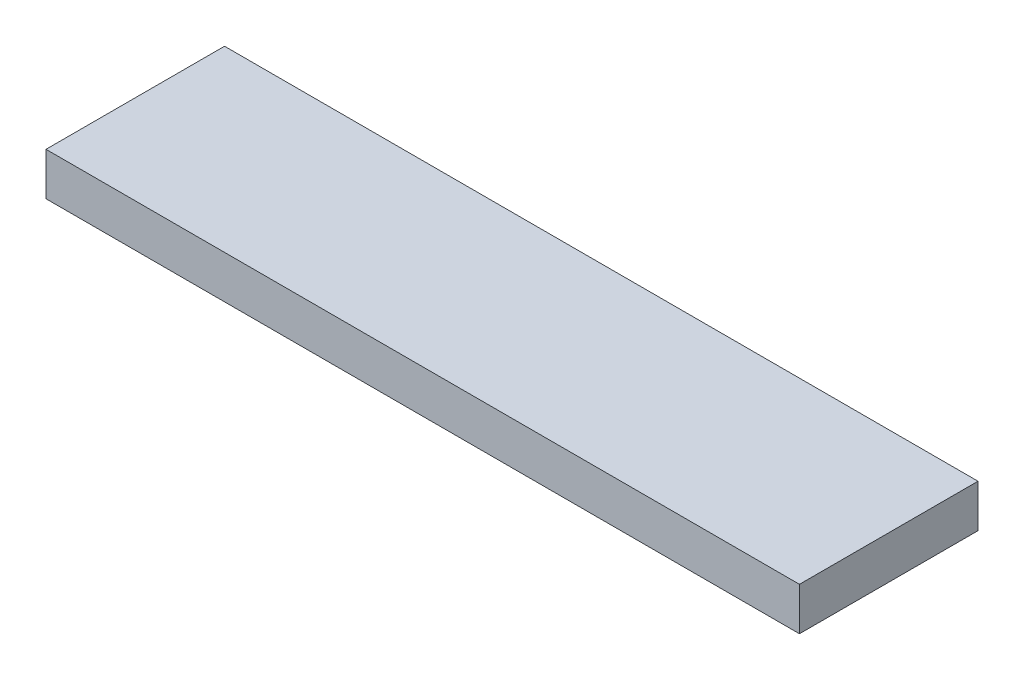
ISO-10303-21;
HEADER;
FILE_DESCRIPTION(('STEP AP214'),'2;1');
FILE_NAME('part.step','',(''),(''),'','','');
FILE_SCHEMA(('AUTOMOTIVE_DESIGN { 1 0 10303 214 1 1 1 1 }'));
ENDSEC;
DATA;
#1=APPLICATION_CONTEXT('core data for automotive mechanical design processes');
#2=APPLICATION_PROTOCOL_DEFINITION('international standard','automotive_design',2000,#1);
#3=PRODUCT_CONTEXT('',#1,'mechanical');
#4=PRODUCT('Part','Part','',(#3));
#5=PRODUCT_RELATED_PRODUCT_CATEGORY('part','',(#4));
#6=PRODUCT_DEFINITION_FORMATION('','',#4);
#7=PRODUCT_DEFINITION_CONTEXT('part definition',#1,'design');
#8=PRODUCT_DEFINITION('design','',#6,#7);
#9=PRODUCT_DEFINITION_SHAPE('','',#8);
#10=(LENGTH_UNIT() NAMED_UNIT(*) SI_UNIT(.MILLI.,.METRE.));
#11=(NAMED_UNIT(*) PLANE_ANGLE_UNIT() SI_UNIT($,.RADIAN.));
#12=(NAMED_UNIT(*) SI_UNIT($,.STERADIAN.) SOLID_ANGLE_UNIT());
#13=UNCERTAINTY_MEASURE_WITH_UNIT(LENGTH_MEASURE(1.E-05),#10,'distance_accuracy_value','');
#14=(GEOMETRIC_REPRESENTATION_CONTEXT(3) GLOBAL_UNCERTAINTY_ASSIGNED_CONTEXT((#13)) GLOBAL_UNIT_ASSIGNED_CONTEXT((#10,
#11,#12)) REPRESENTATION_CONTEXT('',''));
#15=CARTESIAN_POINT('',(0.,0.,0.));
#16=DIRECTION('',(0.,0.,1.));
#17=DIRECTION('',(1.,0.,0.));
#18=AXIS2_PLACEMENT_3D('',#15,#16,#17);
#19=CARTESIAN_POINT('',(105.5,12.,-24.9999999999998));
#20=DIRECTION('',(-1.,0.,0.));
#21=DIRECTION('',(0.,0.,0.999999999999998));
#22=AXIS2_PLACEMENT_3D('',#19,#20,#21);
#23=PLANE('',#22);
#24=DIRECTION('',(0.,0.,-0.999999999999998));
#25=VECTOR('',#24,1.);
#26=CARTESIAN_POINT('',(105.5,0.,-24.9999999999998));
#27=LINE('',#26,#25);
#28=CARTESIAN_POINT('',(105.5,0.,24.9999999999997));
#29=VERTEX_POINT('',#28);
#30=CARTESIAN_POINT('',(105.5,0.,-24.9999999999998));
#31=VERTEX_POINT('',#30);
#32=EDGE_CURVE('E95',#29,#31,#27,.T.);
#33=ORIENTED_EDGE('',*,*,#32,.T.);
#34=DIRECTION('',(0.,-1.,0.));
#35=VECTOR('',#34,1.);
#36=CARTESIAN_POINT('',(105.5,12.,-24.9999999999998));
#37=LINE('',#36,#35);
#38=CARTESIAN_POINT('',(105.5,12.,-24.9999999999998));
#39=VERTEX_POINT('',#38);
#40=EDGE_CURVE('E11',#39,#31,#37,.T.);
#41=ORIENTED_EDGE('',*,*,#40,.F.);
#42=DIRECTION('',(0.,0.,-0.999999999999998));
#43=VECTOR('',#42,1.);
#44=CARTESIAN_POINT('',(105.5,12.,-24.9999999999998));
#45=LINE('',#44,#43);
#46=CARTESIAN_POINT('',(105.5,12.,24.9999999999997));
#47=VERTEX_POINT('',#46);
#48=EDGE_CURVE('E83',#47,#39,#45,.T.);
#49=ORIENTED_EDGE('',*,*,#48,.F.);
#50=DIRECTION('',(0.,-1.,0.));
#51=VECTOR('',#50,1.);
#52=CARTESIAN_POINT('',(105.5,12.,24.9999999999997));
#53=LINE('',#52,#51);
#54=EDGE_CURVE('E91',#47,#29,#53,.T.);
#55=ORIENTED_EDGE('',*,*,#54,.T.);
#56=EDGE_LOOP('',(#33,#41,#49,#55));
#57=FACE_BOUND('',#56,.T.);
#58=ADVANCED_FACE('F32',(#57),#23,.F.);
#59=CARTESIAN_POINT('',(-105.5,12.,-25.));
#60=DIRECTION('',(0.,0.,0.999999999999998));
#61=DIRECTION('',(1.,0.,0.));
#62=AXIS2_PLACEMENT_3D('',#59,#60,#61);
#63=PLANE('',#62);
#64=DIRECTION('',(-1.,0.,0.));
#65=VECTOR('',#64,1.);
#66=CARTESIAN_POINT('',(-105.5,0.,-25.));
#67=LINE('',#66,#65);
#68=CARTESIAN_POINT('',(-105.5,0.,-25.));
#69=VERTEX_POINT('',#68);
#70=EDGE_CURVE('E87',#31,#69,#67,.T.);
#71=ORIENTED_EDGE('',*,*,#70,.T.);
#72=DIRECTION('',(0.,-1.,0.));
#73=VECTOR('',#72,1.);
#74=CARTESIAN_POINT('',(-105.5,12.,-25.));
#75=LINE('',#74,#73);
#76=CARTESIAN_POINT('',(-105.5,12.,-25.));
#77=VERTEX_POINT('',#76);
#78=EDGE_CURVE('E40',#77,#69,#75,.T.);
#79=ORIENTED_EDGE('',*,*,#78,.F.);
#80=DIRECTION('',(-1.,0.,0.));
#81=VECTOR('',#80,1.);
#82=CARTESIAN_POINT('',(-105.5,12.,-25.));
#83=LINE('',#82,#81);
#84=EDGE_CURVE('E78',#39,#77,#83,.T.);
#85=ORIENTED_EDGE('',*,*,#84,.F.);
#86=ORIENTED_EDGE('',*,*,#40,.T.);
#87=EDGE_LOOP('',(#71,#79,#85,#86));
#88=FACE_BOUND('',#87,.T.);
#89=ADVANCED_FACE('F86',(#88),#63,.F.);
#90=CARTESIAN_POINT('',(-105.5,12.,-25.));
#91=DIRECTION('',(1.,0.,0.));
#92=DIRECTION('',(0.,0.,-0.999999999999998));
#93=AXIS2_PLACEMENT_3D('',#90,#91,#92);
#94=PLANE('',#93);
#95=DIRECTION('',(0.,0.,0.999999999999998));
#96=VECTOR('',#95,1.);
#97=CARTESIAN_POINT('',(-105.5,0.,-25.));
#98=LINE('',#97,#96);
#99=CARTESIAN_POINT('',(-105.5,0.,25.));
#100=VERTEX_POINT('',#99);
#101=EDGE_CURVE('E65',#69,#100,#98,.T.);
#102=ORIENTED_EDGE('',*,*,#101,.T.);
#103=DIRECTION('',(0.,-1.,0.));
#104=VECTOR('',#103,1.);
#105=CARTESIAN_POINT('',(-105.5,12.,25.));
#106=LINE('',#105,#104);
#107=CARTESIAN_POINT('',(-105.5,12.,25.));
#108=VERTEX_POINT('',#107);
#109=EDGE_CURVE('E88',#108,#100,#106,.T.);
#110=ORIENTED_EDGE('',*,*,#109,.F.);
#111=DIRECTION('',(0.,0.,0.999999999999998));
#112=VECTOR('',#111,1.);
#113=CARTESIAN_POINT('',(-105.5,12.,-25.));
#114=LINE('',#113,#112);
#115=EDGE_CURVE('E81',#77,#108,#114,.T.);
#116=ORIENTED_EDGE('',*,*,#115,.F.);
#117=ORIENTED_EDGE('',*,*,#78,.T.);
#118=EDGE_LOOP('',(#102,#110,#116,#117));
#119=FACE_BOUND('',#118,.T.);
#120=ADVANCED_FACE('F89',(#119),#94,.F.);
#121=CARTESIAN_POINT('',(-105.5,12.,25.));
#122=DIRECTION('',(0.,0.,-0.999999999999998));
#123=DIRECTION('',(-1.,0.,0.));
#124=AXIS2_PLACEMENT_3D('',#121,#122,#123);
#125=PLANE('',#124);
#126=DIRECTION('',(1.,0.,0.));
#127=VECTOR('',#126,1.);
#128=CARTESIAN_POINT('',(-105.5,0.,25.));
#129=LINE('',#128,#127);
#130=EDGE_CURVE('E71',#100,#29,#129,.T.);
#131=ORIENTED_EDGE('',*,*,#130,.T.);
#132=ORIENTED_EDGE('',*,*,#54,.F.);
#133=DIRECTION('',(1.,0.,0.));
#134=VECTOR('',#133,1.);
#135=CARTESIAN_POINT('',(-105.5,12.,25.));
#136=LINE('',#135,#134);
#137=EDGE_CURVE('E48',#108,#47,#136,.T.);
#138=ORIENTED_EDGE('',*,*,#137,.F.);
#139=ORIENTED_EDGE('',*,*,#109,.T.);
#140=EDGE_LOOP('',(#131,#132,#138,#139));
#141=FACE_BOUND('',#140,.T.);
#142=ADVANCED_FACE('F102',(#141),#125,.F.);
#143=CARTESIAN_POINT('',(1.38777878078145E-13,12.,0.));
#144=DIRECTION('',(0.,1.,0.));
#145=DIRECTION('',(0.,0.,0.999999999999998));
#146=AXIS2_PLACEMENT_3D('',#143,#144,#145);
#147=PLANE('',#146);
#148=ORIENTED_EDGE('',*,*,#48,.T.);
#149=ORIENTED_EDGE('',*,*,#84,.T.);
#150=ORIENTED_EDGE('',*,*,#115,.T.);
#151=ORIENTED_EDGE('',*,*,#137,.T.);
#152=EDGE_LOOP('',(#148,#149,#150,#151));
#153=FACE_BOUND('',#152,.T.);
#154=ADVANCED_FACE('F79',(#153),#147,.T.);
#155=CARTESIAN_POINT('',(0.,0.,0.));
#156=DIRECTION('',(0.,1.,0.));
#157=DIRECTION('',(0.,0.,0.999999999999998));
#158=AXIS2_PLACEMENT_3D('',#155,#156,#157);
#159=PLANE('',#158);
#160=ORIENTED_EDGE('',*,*,#32,.F.);
#161=ORIENTED_EDGE('',*,*,#130,.F.);
#162=ORIENTED_EDGE('',*,*,#101,.F.);
#163=ORIENTED_EDGE('',*,*,#70,.F.);
#164=EDGE_LOOP('',(#160,#161,#162,#163));
#165=FACE_BOUND('',#164,.T.);
#166=ADVANCED_FACE('F105',(#165),#159,.F.);
#167=CLOSED_SHELL('',(#58,#89,#120,#142,#154,#166));
#168=MANIFOLD_SOLID_BREP('B2',#167);
#169=ADVANCED_BREP_SHAPE_REPRESENTATION('',(#18,#168),#14);
#170=SHAPE_DEFINITION_REPRESENTATION(#9,#169);
ENDSEC;
END-ISO-10303-21;
